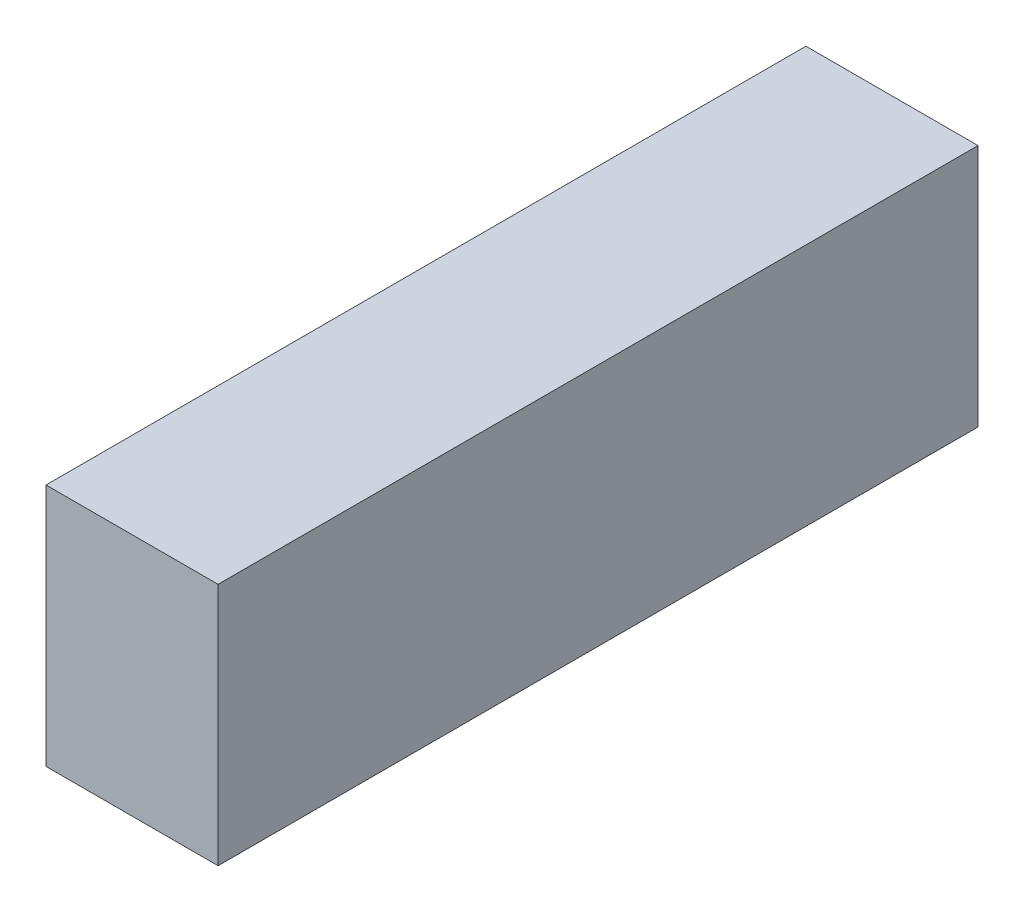
ISO-10303-21;
HEADER;
FILE_DESCRIPTION(('STEP AP214'),'2;1');
FILE_NAME('part.step','',(''),(''),'','','');
FILE_SCHEMA(('AUTOMOTIVE_DESIGN { 1 0 10303 214 1 1 1 1 }'));
ENDSEC;
DATA;
#1=APPLICATION_CONTEXT('core data for automotive mechanical design processes');
#2=APPLICATION_PROTOCOL_DEFINITION('international standard','automotive_design',2000,#1);
#3=PRODUCT_CONTEXT('',#1,'mechanical');
#4=PRODUCT('Part','Part','',(#3));
#5=PRODUCT_RELATED_PRODUCT_CATEGORY('part','',(#4));
#6=PRODUCT_DEFINITION_FORMATION('','',#4);
#7=PRODUCT_DEFINITION_CONTEXT('part definition',#1,'design');
#8=PRODUCT_DEFINITION('design','',#6,#7);
#9=PRODUCT_DEFINITION_SHAPE('','',#8);
#10=(LENGTH_UNIT() NAMED_UNIT(*) SI_UNIT(.MILLI.,.METRE.));
#11=(NAMED_UNIT(*) PLANE_ANGLE_UNIT() SI_UNIT($,.RADIAN.));
#12=(NAMED_UNIT(*) SI_UNIT($,.STERADIAN.) SOLID_ANGLE_UNIT());
#13=UNCERTAINTY_MEASURE_WITH_UNIT(LENGTH_MEASURE(1.E-05),#10,'distance_accuracy_value','');
#14=(GEOMETRIC_REPRESENTATION_CONTEXT(3) GLOBAL_UNCERTAINTY_ASSIGNED_CONTEXT((#13)) GLOBAL_UNIT_ASSIGNED_CONTEXT((#10,
#11,#12)) REPRESENTATION_CONTEXT('',''));
#15=CARTESIAN_POINT('',(0.,0.,0.));
#16=DIRECTION('',(0.,0.,1.));
#17=DIRECTION('',(1.,0.,0.));
#18=AXIS2_PLACEMENT_3D('',#15,#16,#17);
#19=CARTESIAN_POINT('',(-24.,8.,53.));
#20=DIRECTION('',(0.,-1.,0.));
#21=DIRECTION('',(0.,0.,-1.));
#22=AXIS2_PLACEMENT_3D('',#19,#20,#21);
#23=PLANE('',#22);
#24=DIRECTION('',(0.,0.,-1.));
#25=VECTOR('',#24,1.);
#26=CARTESIAN_POINT('',(0.,8.,53.));
#27=LINE('',#26,#25);
#28=CARTESIAN_POINT('',(0.,8.,53.));
#29=VERTEX_POINT('',#28);
#30=CARTESIAN_POINT('',(0.,8.,-53.));
#31=VERTEX_POINT('',#30);
#32=EDGE_CURVE('E104',#29,#31,#27,.T.);
#33=ORIENTED_EDGE('',*,*,#32,.F.);
#34=DIRECTION('',(1.,0.,0.));
#35=VECTOR('',#34,1.);
#36=CARTESIAN_POINT('',(-24.,8.,53.));
#37=LINE('',#36,#35);
#38=CARTESIAN_POINT('',(-24.,8.,53.));
#39=VERTEX_POINT('',#38);
#40=EDGE_CURVE('E11',#39,#29,#37,.T.);
#41=ORIENTED_EDGE('',*,*,#40,.F.);
#42=DIRECTION('',(0.,0.,-1.));
#43=VECTOR('',#42,1.);
#44=CARTESIAN_POINT('',(-24.,8.,53.));
#45=LINE('',#44,#43);
#46=CARTESIAN_POINT('',(-24.,8.,-53.));
#47=VERTEX_POINT('',#46);
#48=EDGE_CURVE('E97',#39,#47,#45,.T.);
#49=ORIENTED_EDGE('',*,*,#48,.T.);
#50=DIRECTION('',(1.,0.,0.));
#51=VECTOR('',#50,1.);
#52=CARTESIAN_POINT('',(-24.,8.,-53.));
#53=LINE('',#52,#51);
#54=EDGE_CURVE('E42',#47,#31,#53,.T.);
#55=ORIENTED_EDGE('',*,*,#54,.T.);
#56=EDGE_LOOP('',(#33,#41,#49,#55));
#57=FACE_BOUND('',#56,.T.);
#58=ADVANCED_FACE('F41',(#57),#23,.T.);
#59=CARTESIAN_POINT('',(-24.,42.,53.));
#60=DIRECTION('',(0.,0.,1.));
#61=DIRECTION('',(1.,0.,0.));
#62=AXIS2_PLACEMENT_3D('',#59,#60,#61);
#63=PLANE('',#62);
#64=DIRECTION('',(0.,-1.,0.));
#65=VECTOR('',#64,1.);
#66=CARTESIAN_POINT('',(0.,42.,53.));
#67=LINE('',#66,#65);
#68=CARTESIAN_POINT('',(0.,42.,53.));
#69=VERTEX_POINT('',#68);
#70=EDGE_CURVE('E101',#69,#29,#67,.T.);
#71=ORIENTED_EDGE('',*,*,#70,.F.);
#72=DIRECTION('',(1.,0.,0.));
#73=VECTOR('',#72,1.);
#74=CARTESIAN_POINT('',(-24.,42.,53.));
#75=LINE('',#74,#73);
#76=CARTESIAN_POINT('',(-24.,42.,53.));
#77=VERTEX_POINT('',#76);
#78=EDGE_CURVE('E49',#77,#69,#75,.T.);
#79=ORIENTED_EDGE('',*,*,#78,.F.);
#80=DIRECTION('',(0.,-1.,0.));
#81=VECTOR('',#80,1.);
#82=CARTESIAN_POINT('',(-24.,42.,53.));
#83=LINE('',#82,#81);
#84=EDGE_CURVE('E96',#77,#39,#83,.T.);
#85=ORIENTED_EDGE('',*,*,#84,.T.);
#86=ORIENTED_EDGE('',*,*,#40,.T.);
#87=EDGE_LOOP('',(#71,#79,#85,#86));
#88=FACE_BOUND('',#87,.T.);
#89=ADVANCED_FACE('F113',(#88),#63,.T.);
#90=CARTESIAN_POINT('',(-24.,42.,-53.));
#91=DIRECTION('',(0.,1.,0.));
#92=DIRECTION('',(0.,0.,1.));
#93=AXIS2_PLACEMENT_3D('',#90,#91,#92);
#94=PLANE('',#93);
#95=DIRECTION('',(0.,0.,1.));
#96=VECTOR('',#95,1.);
#97=CARTESIAN_POINT('',(0.,42.,-53.));
#98=LINE('',#97,#96);
#99=CARTESIAN_POINT('',(0.,42.,-53.));
#100=VERTEX_POINT('',#99);
#101=EDGE_CURVE('E93',#100,#69,#98,.T.);
#102=ORIENTED_EDGE('',*,*,#101,.F.);
#103=DIRECTION('',(1.,0.,0.));
#104=VECTOR('',#103,1.);
#105=CARTESIAN_POINT('',(-24.,42.,-53.));
#106=LINE('',#105,#104);
#107=CARTESIAN_POINT('',(-24.,42.,-53.));
#108=VERTEX_POINT('',#107);
#109=EDGE_CURVE('E88',#108,#100,#106,.T.);
#110=ORIENTED_EDGE('',*,*,#109,.F.);
#111=DIRECTION('',(0.,0.,1.));
#112=VECTOR('',#111,1.);
#113=CARTESIAN_POINT('',(-24.,42.,-53.));
#114=LINE('',#113,#112);
#115=EDGE_CURVE('E90',#108,#77,#114,.T.);
#116=ORIENTED_EDGE('',*,*,#115,.T.);
#117=ORIENTED_EDGE('',*,*,#78,.T.);
#118=EDGE_LOOP('',(#102,#110,#116,#117));
#119=FACE_BOUND('',#118,.T.);
#120=ADVANCED_FACE('F86',(#119),#94,.T.);
#121=CARTESIAN_POINT('',(-24.,8.,-53.));
#122=DIRECTION('',(0.,0.,-1.));
#123=DIRECTION('',(-1.,0.,0.));
#124=AXIS2_PLACEMENT_3D('',#121,#122,#123);
#125=PLANE('',#124);
#126=DIRECTION('',(0.,1.,0.));
#127=VECTOR('',#126,1.);
#128=CARTESIAN_POINT('',(0.,8.,-53.));
#129=LINE('',#128,#127);
#130=EDGE_CURVE('E107',#31,#100,#129,.T.);
#131=ORIENTED_EDGE('',*,*,#130,.F.);
#132=ORIENTED_EDGE('',*,*,#54,.F.);
#133=DIRECTION('',(0.,1.,0.));
#134=VECTOR('',#133,1.);
#135=CARTESIAN_POINT('',(-24.,8.,-53.));
#136=LINE('',#135,#134);
#137=EDGE_CURVE('E92',#47,#108,#136,.T.);
#138=ORIENTED_EDGE('',*,*,#137,.T.);
#139=ORIENTED_EDGE('',*,*,#109,.T.);
#140=EDGE_LOOP('',(#131,#132,#138,#139));
#141=FACE_BOUND('',#140,.T.);
#142=ADVANCED_FACE('F98',(#141),#125,.T.);
#143=CARTESIAN_POINT('',(-24.,0.,0.));
#144=DIRECTION('',(1.,0.,0.));
#145=DIRECTION('',(0.,0.,-1.));
#146=AXIS2_PLACEMENT_3D('',#143,#144,#145);
#147=PLANE('',#146);
#148=ORIENTED_EDGE('',*,*,#48,.F.);
#149=ORIENTED_EDGE('',*,*,#84,.F.);
#150=ORIENTED_EDGE('',*,*,#115,.F.);
#151=ORIENTED_EDGE('',*,*,#137,.F.);
#152=EDGE_LOOP('',(#148,#149,#150,#151));
#153=FACE_BOUND('',#152,.T.);
#154=ADVANCED_FACE('F94',(#153),#147,.F.);
#155=CARTESIAN_POINT('',(0.,0.,0.));
#156=DIRECTION('',(1.,0.,0.));
#157=DIRECTION('',(0.,0.,-1.));
#158=AXIS2_PLACEMENT_3D('',#155,#156,#157);
#159=PLANE('',#158);
#160=ORIENTED_EDGE('',*,*,#32,.T.);
#161=ORIENTED_EDGE('',*,*,#130,.T.);
#162=ORIENTED_EDGE('',*,*,#101,.T.);
#163=ORIENTED_EDGE('',*,*,#70,.T.);
#164=EDGE_LOOP('',(#160,#161,#162,#163));
#165=FACE_BOUND('',#164,.T.);
#166=ADVANCED_FACE('F111',(#165),#159,.T.);
#167=CLOSED_SHELL('',(#58,#89,#120,#142,#154,#166));
#168=MANIFOLD_SOLID_BREP('B2',#167);
#169=ADVANCED_BREP_SHAPE_REPRESENTATION('',(#18,#168),#14);
#170=SHAPE_DEFINITION_REPRESENTATION(#9,#169);
ENDSEC;
END-ISO-10303-21;
